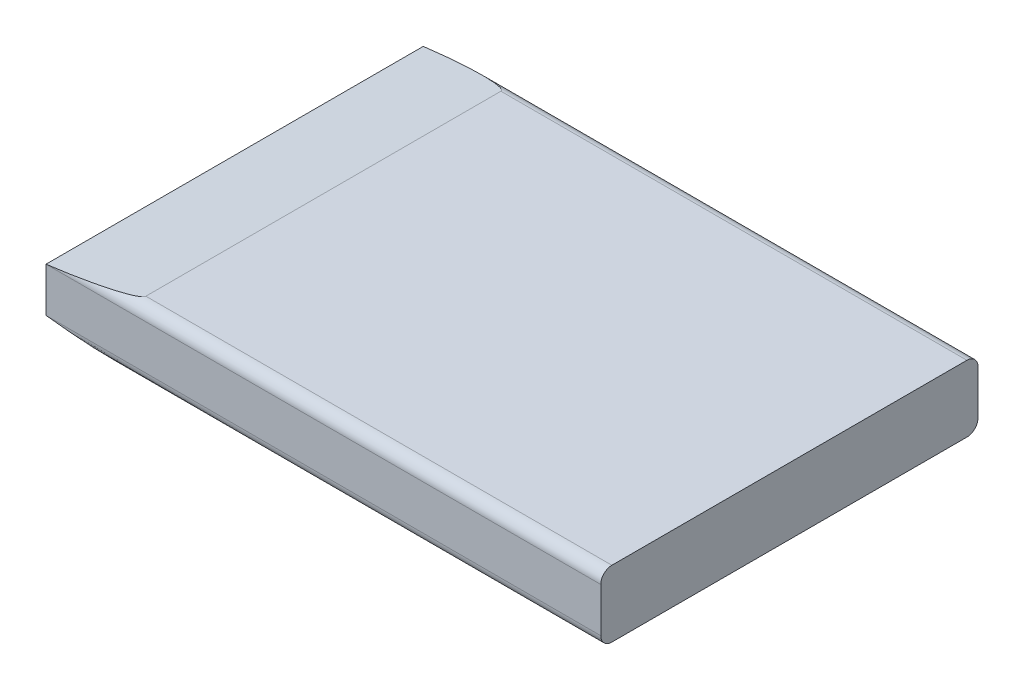
ISO-10303-21;
HEADER;
FILE_DESCRIPTION(('STEP AP214'),'2;1');
FILE_NAME('part.step','',(''),(''),'','','');
FILE_SCHEMA(('AUTOMOTIVE_DESIGN { 1 0 10303 214 1 1 1 1 }'));
ENDSEC;
DATA;
#1=APPLICATION_CONTEXT('core data for automotive mechanical design processes');
#2=APPLICATION_PROTOCOL_DEFINITION('international standard','automotive_design',2000,#1);
#3=PRODUCT_CONTEXT('',#1,'mechanical');
#4=PRODUCT('Part','Part','',(#3));
#5=PRODUCT_RELATED_PRODUCT_CATEGORY('part','',(#4));
#6=PRODUCT_DEFINITION_FORMATION('','',#4);
#7=PRODUCT_DEFINITION_CONTEXT('part definition',#1,'design');
#8=PRODUCT_DEFINITION('design','',#6,#7);
#9=PRODUCT_DEFINITION_SHAPE('','',#8);
#10=(LENGTH_UNIT() NAMED_UNIT(*) SI_UNIT(.MILLI.,.METRE.));
#11=(NAMED_UNIT(*) PLANE_ANGLE_UNIT() SI_UNIT($,.RADIAN.));
#12=(NAMED_UNIT(*) SI_UNIT($,.STERADIAN.) SOLID_ANGLE_UNIT());
#13=UNCERTAINTY_MEASURE_WITH_UNIT(LENGTH_MEASURE(1.E-05),#10,'distance_accuracy_value','');
#14=(GEOMETRIC_REPRESENTATION_CONTEXT(3) GLOBAL_UNCERTAINTY_ASSIGNED_CONTEXT((#13)) GLOBAL_UNIT_ASSIGNED_CONTEXT((#10,
#11,#12)) REPRESENTATION_CONTEXT('',''));
#15=CARTESIAN_POINT('',(0.,0.,0.));
#16=DIRECTION('',(0.,0.,1.));
#17=DIRECTION('',(1.,0.,0.));
#18=AXIS2_PLACEMENT_3D('',#15,#16,#17);
#19=CARTESIAN_POINT('',(25.,6.,17.));
#20=DIRECTION('',(-1.,0.,0.));
#21=DIRECTION('',(0.,0.,1.));
#22=AXIS2_PLACEMENT_3D('',#19,#20,#21);
#23=PLANE('',#22);
#24=DIRECTION('',(0.,-1.,0.));
#25=VECTOR('',#24,1.);
#26=CARTESIAN_POINT('',(25.,6.,17.));
#27=LINE('',#26,#25);
#28=CARTESIAN_POINT('',(25.,5.,17.));
#29=VERTEX_POINT('',#28);
#30=CARTESIAN_POINT('',(25.,1.,17.));
#31=VERTEX_POINT('',#30);
#32=EDGE_CURVE('E137',#29,#31,#27,.T.);
#33=ORIENTED_EDGE('',*,*,#32,.T.);
#34=CARTESIAN_POINT('',(25.,1.,16.));
#35=DIRECTION('',(-1.,0.,0.));
#36=DIRECTION('',(0.,0.,1.));
#37=AXIS2_PLACEMENT_3D('',#34,#35,#36);
#38=CIRCLE('',#37,1.);
#39=CARTESIAN_POINT('',(25.,0.,16.));
#40=VERTEX_POINT('',#39);
#41=EDGE_CURVE('E158',#31,#40,#38,.F.);
#42=ORIENTED_EDGE('',*,*,#41,.T.);
#43=DIRECTION('',(0.,0.,-1.));
#44=VECTOR('',#43,1.);
#45=CARTESIAN_POINT('',(25.,0.,17.));
#46=LINE('',#45,#44);
#47=CARTESIAN_POINT('',(25.,0.,-16.));
#48=VERTEX_POINT('',#47);
#49=EDGE_CURVE('E126',#40,#48,#46,.T.);
#50=ORIENTED_EDGE('',*,*,#49,.T.);
#51=CARTESIAN_POINT('',(25.,1.,-16.));
#52=DIRECTION('',(-1.,0.,0.));
#53=DIRECTION('',(0.,0.,1.));
#54=AXIS2_PLACEMENT_3D('',#51,#52,#53);
#55=CIRCLE('',#54,1.);
#56=CARTESIAN_POINT('',(25.,1.,-17.));
#57=VERTEX_POINT('',#56);
#58=EDGE_CURVE('E152',#48,#57,#55,.F.);
#59=ORIENTED_EDGE('',*,*,#58,.T.);
#60=DIRECTION('',(0.,-1.,0.));
#61=VECTOR('',#60,1.);
#62=CARTESIAN_POINT('',(25.,6.,-17.));
#63=LINE('',#62,#61);
#64=CARTESIAN_POINT('',(25.,5.,-17.));
#65=VERTEX_POINT('',#64);
#66=EDGE_CURVE('E139',#65,#57,#63,.T.);
#67=ORIENTED_EDGE('',*,*,#66,.F.);
#68=CARTESIAN_POINT('',(25.,5.,-16.));
#69=DIRECTION('',(-1.,0.,0.));
#70=DIRECTION('',(0.,0.,1.));
#71=AXIS2_PLACEMENT_3D('',#68,#69,#70);
#72=CIRCLE('',#71,1.);
#73=CARTESIAN_POINT('',(25.,6.,-16.));
#74=VERTEX_POINT('',#73);
#75=EDGE_CURVE('E154',#65,#74,#72,.F.);
#76=ORIENTED_EDGE('',*,*,#75,.T.);
#77=DIRECTION('',(0.,0.,-1.));
#78=VECTOR('',#77,1.);
#79=CARTESIAN_POINT('',(25.,6.,17.));
#80=LINE('',#79,#78);
#81=CARTESIAN_POINT('',(25.,6.,16.));
#82=VERTEX_POINT('',#81);
#83=EDGE_CURVE('E145',#82,#74,#80,.T.);
#84=ORIENTED_EDGE('',*,*,#83,.F.);
#85=CARTESIAN_POINT('',(25.,5.,16.));
#86=DIRECTION('',(-1.,0.,0.));
#87=DIRECTION('',(0.,0.,1.));
#88=AXIS2_PLACEMENT_3D('',#85,#86,#87);
#89=CIRCLE('',#88,1.);
#90=EDGE_CURVE('E156',#82,#29,#89,.F.);
#91=ORIENTED_EDGE('',*,*,#90,.T.);
#92=EDGE_LOOP('',(#33,#42,#50,#59,#67,#76,#84,#91));
#93=FACE_BOUND('',#92,.T.);
#94=ADVANCED_FACE('F47',(#93),#23,.F.);
#95=CARTESIAN_POINT('',(-25.,6.,-17.));
#96=DIRECTION('',(0.,0.,1.));
#97=DIRECTION('',(1.,0.,0.));
#98=AXIS2_PLACEMENT_3D('',#95,#96,#97);
#99=PLANE('',#98);
#100=DIRECTION('',(0.,-1.,0.));
#101=VECTOR('',#100,1.);
#102=CARTESIAN_POINT('',(-25.,6.,-17.));
#103=LINE('',#102,#101);
#104=CARTESIAN_POINT('',(-25.,5.,-17.));
#105=VERTEX_POINT('',#104);
#106=CARTESIAN_POINT('',(-25.,1.,-17.));
#107=VERTEX_POINT('',#106);
#108=EDGE_CURVE('E142',#105,#107,#103,.T.);
#109=ORIENTED_EDGE('',*,*,#108,.F.);
#110=DIRECTION('',(-1.,0.,0.));
#111=VECTOR('',#110,1.);
#112=CARTESIAN_POINT('',(-25.,5.,-17.));
#113=LINE('',#112,#111);
#114=EDGE_CURVE('E172',#105,#65,#113,.F.);
#115=ORIENTED_EDGE('',*,*,#114,.T.);
#116=ORIENTED_EDGE('',*,*,#66,.T.);
#117=DIRECTION('',(-1.,0.,0.));
#118=VECTOR('',#117,1.);
#119=CARTESIAN_POINT('',(-25.,1.,-17.));
#120=LINE('',#119,#118);
#121=EDGE_CURVE('E169',#57,#107,#120,.T.);
#122=ORIENTED_EDGE('',*,*,#121,.T.);
#123=EDGE_LOOP('',(#109,#115,#116,#122));
#124=FACE_BOUND('',#123,.T.);
#125=ADVANCED_FACE('F191',(#124),#99,.F.);
#126=CARTESIAN_POINT('',(-25.,6.,17.));
#127=DIRECTION('',(1.,0.,0.));
#128=DIRECTION('',(0.,0.,-1.));
#129=AXIS2_PLACEMENT_3D('',#126,#127,#128);
#130=PLANE('',#129);
#131=ORIENTED_EDGE('',*,*,#108,.T.);
#132=DIRECTION('',(0.,0.,1.));
#133=VECTOR('',#132,1.);
#134=CARTESIAN_POINT('',(-25.,1.,-23.));
#135=LINE('',#134,#133);
#136=CARTESIAN_POINT('',(-25.,1.,17.));
#137=VERTEX_POINT('',#136);
#138=EDGE_CURVE('E69',#107,#137,#135,.T.);
#139=ORIENTED_EDGE('',*,*,#138,.T.);
#140=DIRECTION('',(0.,-1.,0.));
#141=VECTOR('',#140,1.);
#142=CARTESIAN_POINT('',(-25.,6.,17.));
#143=LINE('',#142,#141);
#144=CARTESIAN_POINT('',(-25.,5.,17.));
#145=VERTEX_POINT('',#144);
#146=EDGE_CURVE('E134',#145,#137,#143,.T.);
#147=ORIENTED_EDGE('',*,*,#146,.F.);
#148=DIRECTION('',(0.,0.,1.));
#149=VECTOR('',#148,1.);
#150=CARTESIAN_POINT('',(-25.,5.,-23.));
#151=LINE('',#150,#149);
#152=EDGE_CURVE('E109',#105,#145,#151,.T.);
#153=ORIENTED_EDGE('',*,*,#152,.F.);
#154=EDGE_LOOP('',(#131,#139,#147,#153));
#155=FACE_BOUND('',#154,.T.);
#156=ADVANCED_FACE('F141',(#155),#130,.F.);
#157=CARTESIAN_POINT('',(-25.,6.,17.));
#158=DIRECTION('',(0.,0.,-1.));
#159=DIRECTION('',(-1.,0.,0.));
#160=AXIS2_PLACEMENT_3D('',#157,#158,#159);
#161=PLANE('',#160);
#162=ORIENTED_EDGE('',*,*,#146,.T.);
#163=DIRECTION('',(1.,0.,0.));
#164=VECTOR('',#163,1.);
#165=CARTESIAN_POINT('',(25.,1.,17.));
#166=LINE('',#165,#164);
#167=EDGE_CURVE('E138',#137,#31,#166,.T.);
#168=ORIENTED_EDGE('',*,*,#167,.T.);
#169=ORIENTED_EDGE('',*,*,#32,.F.);
#170=DIRECTION('',(1.,0.,0.));
#171=VECTOR('',#170,1.);
#172=CARTESIAN_POINT('',(-25.,5.,17.));
#173=LINE('',#172,#171);
#174=EDGE_CURVE('E124',#29,#145,#173,.F.);
#175=ORIENTED_EDGE('',*,*,#174,.T.);
#176=EDGE_LOOP('',(#162,#168,#169,#175));
#177=FACE_BOUND('',#176,.T.);
#178=ADVANCED_FACE('F132',(#177),#161,.F.);
#179=CARTESIAN_POINT('',(0.,6.,0.));
#180=DIRECTION('',(0.,-1.,0.));
#181=DIRECTION('',(0.,0.,-1.));
#182=AXIS2_PLACEMENT_3D('',#179,#180,#181);
#183=PLANE('',#182);
#184=DIRECTION('',(-1.,0.,0.));
#185=VECTOR('',#184,1.);
#186=CARTESIAN_POINT('',(0.,6.,-16.));
#187=LINE('',#186,#185);
#188=CARTESIAN_POINT('',(-17.,6.,-16.));
#189=VERTEX_POINT('',#188);
#190=EDGE_CURVE('E165',#74,#189,#187,.T.);
#191=ORIENTED_EDGE('',*,*,#190,.T.);
#192=DIRECTION('',(0.,0.,1.));
#193=VECTOR('',#192,1.);
#194=CARTESIAN_POINT('',(-17.,6.,-23.));
#195=LINE('',#194,#193);
#196=CARTESIAN_POINT('',(-17.,6.,16.));
#197=VERTEX_POINT('',#196);
#198=EDGE_CURVE('E61',#189,#197,#195,.T.);
#199=ORIENTED_EDGE('',*,*,#198,.T.);
#200=DIRECTION('',(1.,0.,0.));
#201=VECTOR('',#200,1.);
#202=CARTESIAN_POINT('',(0.,6.,16.));
#203=LINE('',#202,#201);
#204=EDGE_CURVE('E125',#197,#82,#203,.T.);
#205=ORIENTED_EDGE('',*,*,#204,.T.);
#206=ORIENTED_EDGE('',*,*,#83,.T.);
#207=EDGE_LOOP('',(#191,#199,#205,#206));
#208=FACE_BOUND('',#207,.T.);
#209=ADVANCED_FACE('F199',(#208),#183,.F.);
#210=CARTESIAN_POINT('',(0.,0.,0.));
#211=DIRECTION('',(0.,-1.,0.));
#212=DIRECTION('',(0.,0.,-1.));
#213=AXIS2_PLACEMENT_3D('',#210,#211,#212);
#214=PLANE('',#213);
#215=DIRECTION('',(0.,0.,1.));
#216=VECTOR('',#215,1.);
#217=CARTESIAN_POINT('',(-17.,0.,-23.));
#218=LINE('',#217,#216);
#219=CARTESIAN_POINT('',(-17.,0.,-16.));
#220=VERTEX_POINT('',#219);
#221=CARTESIAN_POINT('',(-17.,0.,16.));
#222=VERTEX_POINT('',#221);
#223=EDGE_CURVE('E175',#220,#222,#218,.T.);
#224=ORIENTED_EDGE('',*,*,#223,.F.);
#225=DIRECTION('',(-1.,0.,0.));
#226=VECTOR('',#225,1.);
#227=CARTESIAN_POINT('',(25.,0.,-16.));
#228=LINE('',#227,#226);
#229=EDGE_CURVE('E160',#220,#48,#228,.F.);
#230=ORIENTED_EDGE('',*,*,#229,.T.);
#231=ORIENTED_EDGE('',*,*,#49,.F.);
#232=DIRECTION('',(1.,0.,0.));
#233=VECTOR('',#232,1.);
#234=CARTESIAN_POINT('',(-25.,0.,16.));
#235=LINE('',#234,#233);
#236=EDGE_CURVE('E162',#40,#222,#235,.F.);
#237=ORIENTED_EDGE('',*,*,#236,.T.);
#238=EDGE_LOOP('',(#224,#230,#231,#237));
#239=FACE_BOUND('',#238,.T.);
#240=ADVANCED_FACE('F181',(#239),#214,.T.);
#241=CARTESIAN_POINT('',(-25.,1.,16.));
#242=DIRECTION('',(-1.,0.,0.));
#243=DIRECTION('',(0.,0.,1.));
#244=AXIS2_PLACEMENT_3D('',#241,#242,#243);
#245=CYLINDRICAL_SURFACE('',#244,1.);
#246=CARTESIAN_POINT('',(-25.,1.,16.));
#247=DIRECTION('',(0.124034734589208,0.992277876713668,0.));
#248=DIRECTION('',(-0.992277876713668,0.124034734589208,0.));
#249=AXIS2_PLACEMENT_3D('',#246,#247,#248);
#250=ELLIPSE('',#249,8.06225774829855,1.);
#251=EDGE_CURVE('E127',#222,#137,#250,.F.);
#252=ORIENTED_EDGE('',*,*,#251,.F.);
#253=ORIENTED_EDGE('',*,*,#236,.F.);
#254=ORIENTED_EDGE('',*,*,#41,.F.);
#255=ORIENTED_EDGE('',*,*,#167,.F.);
#256=EDGE_LOOP('',(#252,#253,#254,#255));
#257=FACE_BOUND('',#256,.T.);
#258=ADVANCED_FACE('F205',(#257),#245,.T.);
#259=CARTESIAN_POINT('',(0.,5.,16.));
#260=DIRECTION('',(1.,0.,0.));
#261=DIRECTION('',(0.,0.,-1.));
#262=AXIS2_PLACEMENT_3D('',#259,#260,#261);
#263=CYLINDRICAL_SURFACE('',#262,1.);
#264=CARTESIAN_POINT('',(-25.,5.,16.));
#265=DIRECTION('',(0.124034734589208,-0.992277876713668,0.));
#266=DIRECTION('',(0.992277876713668,0.124034734589208,0.));
#267=AXIS2_PLACEMENT_3D('',#264,#265,#266);
#268=ELLIPSE('',#267,8.06225774829855,1.);
#269=EDGE_CURVE('E112',#145,#197,#268,.F.);
#270=ORIENTED_EDGE('',*,*,#269,.F.);
#271=ORIENTED_EDGE('',*,*,#174,.F.);
#272=ORIENTED_EDGE('',*,*,#90,.F.);
#273=ORIENTED_EDGE('',*,*,#204,.F.);
#274=EDGE_LOOP('',(#270,#271,#272,#273));
#275=FACE_BOUND('',#274,.T.);
#276=ADVANCED_FACE('F122',(#275),#263,.T.);
#277=CARTESIAN_POINT('',(0.,5.,-16.));
#278=DIRECTION('',(-1.,0.,0.));
#279=DIRECTION('',(0.,0.,1.));
#280=AXIS2_PLACEMENT_3D('',#277,#278,#279);
#281=CYLINDRICAL_SURFACE('',#280,1.);
#282=CARTESIAN_POINT('',(-25.,5.,-16.));
#283=DIRECTION('',(0.124034734589208,-0.992277876713668,0.));
#284=DIRECTION('',(-0.992277876713668,-0.124034734589208,0.));
#285=AXIS2_PLACEMENT_3D('',#282,#283,#284);
#286=ELLIPSE('',#285,8.06225774829855,1.);
#287=EDGE_CURVE('E11',#189,#105,#286,.F.);
#288=ORIENTED_EDGE('',*,*,#287,.F.);
#289=ORIENTED_EDGE('',*,*,#190,.F.);
#290=ORIENTED_EDGE('',*,*,#75,.F.);
#291=ORIENTED_EDGE('',*,*,#114,.F.);
#292=EDGE_LOOP('',(#288,#289,#290,#291));
#293=FACE_BOUND('',#292,.T.);
#294=ADVANCED_FACE('F194',(#293),#281,.T.);
#295=CARTESIAN_POINT('',(-25.,1.,-16.));
#296=DIRECTION('',(1.,0.,0.));
#297=DIRECTION('',(0.,0.,-1.));
#298=AXIS2_PLACEMENT_3D('',#295,#296,#297);
#299=CYLINDRICAL_SURFACE('',#298,1.);
#300=CARTESIAN_POINT('',(-25.,1.,-16.));
#301=DIRECTION('',(0.124034734589208,0.992277876713668,0.));
#302=DIRECTION('',(0.992277876713668,-0.124034734589208,0.));
#303=AXIS2_PLACEMENT_3D('',#300,#301,#302);
#304=ELLIPSE('',#303,8.06225774829855,1.);
#305=EDGE_CURVE('E55',#107,#220,#304,.F.);
#306=ORIENTED_EDGE('',*,*,#305,.F.);
#307=ORIENTED_EDGE('',*,*,#121,.F.);
#308=ORIENTED_EDGE('',*,*,#58,.F.);
#309=ORIENTED_EDGE('',*,*,#229,.F.);
#310=EDGE_LOOP('',(#306,#307,#308,#309));
#311=FACE_BOUND('',#310,.T.);
#312=ADVANCED_FACE('F49',(#311),#299,.T.);
#313=CARTESIAN_POINT('',(-17.,0.,-23.));
#314=DIRECTION('',(0.124034734589208,0.992277876713668,0.));
#315=DIRECTION('',(-0.992277876713668,0.124034734589208,0.));
#316=AXIS2_PLACEMENT_3D('',#313,#314,#315);
#317=PLANE('',#316);
#318=ORIENTED_EDGE('',*,*,#251,.T.);
#319=ORIENTED_EDGE('',*,*,#138,.F.);
#320=ORIENTED_EDGE('',*,*,#305,.T.);
#321=ORIENTED_EDGE('',*,*,#223,.T.);
#322=EDGE_LOOP('',(#318,#319,#320,#321));
#323=FACE_BOUND('',#322,.T.);
#324=ADVANCED_FACE('F174',(#323),#317,.F.);
#325=CARTESIAN_POINT('',(-25.,5.,-23.));
#326=DIRECTION('',(0.124034734589208,-0.992277876713668,0.));
#327=DIRECTION('',(0.992277876713668,0.124034734589208,0.));
#328=AXIS2_PLACEMENT_3D('',#325,#326,#327);
#329=PLANE('',#328);
#330=ORIENTED_EDGE('',*,*,#269,.T.);
#331=ORIENTED_EDGE('',*,*,#198,.F.);
#332=ORIENTED_EDGE('',*,*,#287,.T.);
#333=ORIENTED_EDGE('',*,*,#152,.T.);
#334=EDGE_LOOP('',(#330,#331,#332,#333));
#335=FACE_BOUND('',#334,.T.);
#336=ADVANCED_FACE('F111',(#335),#329,.F.);
#337=CLOSED_SHELL('',(#94,#125,#156,#178,#209,#240,#258,#276,#294,#312,#324,#336));
#338=MANIFOLD_SOLID_BREP('B2',#337);
#339=ADVANCED_BREP_SHAPE_REPRESENTATION('',(#18,#338),#14);
#340=SHAPE_DEFINITION_REPRESENTATION(#9,#339);
ENDSEC;
END-ISO-10303-21;
